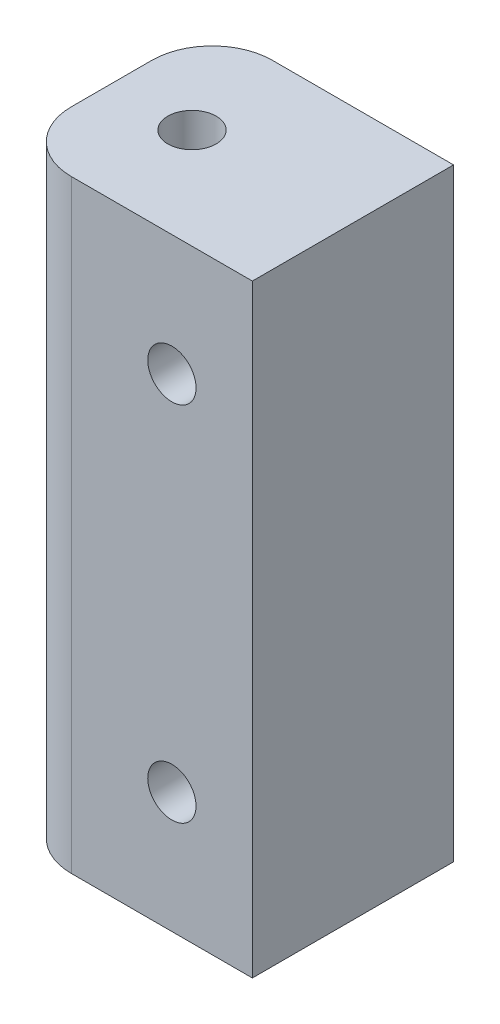
ISO-10303-21;
HEADER;
FILE_DESCRIPTION(('STEP AP214'),'2;1');
FILE_NAME('part.step','',(''),(''),'','','');
FILE_SCHEMA(('AUTOMOTIVE_DESIGN { 1 0 10303 214 1 1 1 1 }'));
ENDSEC;
DATA;
#1=APPLICATION_CONTEXT('core data for automotive mechanical design processes');
#2=APPLICATION_PROTOCOL_DEFINITION('international standard','automotive_design',2000,#1);
#3=PRODUCT_CONTEXT('',#1,'mechanical');
#4=PRODUCT('Part','Part','',(#3));
#5=PRODUCT_RELATED_PRODUCT_CATEGORY('part','',(#4));
#6=PRODUCT_DEFINITION_FORMATION('','',#4);
#7=PRODUCT_DEFINITION_CONTEXT('part definition',#1,'design');
#8=PRODUCT_DEFINITION('design','',#6,#7);
#9=PRODUCT_DEFINITION_SHAPE('','',#8);
#10=(LENGTH_UNIT() NAMED_UNIT(*) SI_UNIT(.MILLI.,.METRE.));
#11=(NAMED_UNIT(*) PLANE_ANGLE_UNIT() SI_UNIT($,.RADIAN.));
#12=(NAMED_UNIT(*) SI_UNIT($,.STERADIAN.) SOLID_ANGLE_UNIT());
#13=UNCERTAINTY_MEASURE_WITH_UNIT(LENGTH_MEASURE(1.E-05),#10,'distance_accuracy_value','');
#14=(GEOMETRIC_REPRESENTATION_CONTEXT(3) GLOBAL_UNCERTAINTY_ASSIGNED_CONTEXT((#13)) GLOBAL_UNIT_ASSIGNED_CONTEXT((#10,
#11,#12)) REPRESENTATION_CONTEXT('',''));
#15=CARTESIAN_POINT('',(0.,0.,0.));
#16=DIRECTION('',(0.,0.,1.));
#17=DIRECTION('',(1.,0.,0.));
#18=AXIS2_PLACEMENT_3D('',#15,#16,#17);
#19=CARTESIAN_POINT('',(0.,15.,0.));
#20=DIRECTION('',(0.,1.,0.));
#21=DIRECTION('',(0.,0.,1.));
#22=AXIS2_PLACEMENT_3D('',#19,#20,#21);
#23=PLANE('',#22);
#24=DIRECTION('',(-1.,0.,0.));
#25=VECTOR('',#24,1.);
#26=CARTESIAN_POINT('',(-6.,15.,-10.));
#27=LINE('',#26,#25);
#28=CARTESIAN_POINT('',(6.,15.,-10.));
#29=VERTEX_POINT('',#28);
#30=CARTESIAN_POINT('',(-3.,15.,-10.));
#31=VERTEX_POINT('',#30);
#32=EDGE_CURVE('E108',#29,#31,#27,.T.);
#33=ORIENTED_EDGE('',*,*,#32,.T.);
#34=CARTESIAN_POINT('',(-3.,15.,-7.));
#35=DIRECTION('',(0.,1.,0.));
#36=DIRECTION('',(0.,0.,1.));
#37=AXIS2_PLACEMENT_3D('',#34,#35,#36);
#38=CIRCLE('',#37,3.);
#39=CARTESIAN_POINT('',(-6.,15.,-7.));
#40=VERTEX_POINT('',#39);
#41=EDGE_CURVE('E41',#31,#40,#38,.T.);
#42=ORIENTED_EDGE('',*,*,#41,.T.);
#43=DIRECTION('',(0.,0.,1.));
#44=VECTOR('',#43,1.);
#45=CARTESIAN_POINT('',(-6.,15.,-10.));
#46=LINE('',#45,#44);
#47=CARTESIAN_POINT('',(-6.,15.,-3.));
#48=VERTEX_POINT('',#47);
#49=EDGE_CURVE('E94',#40,#48,#46,.T.);
#50=ORIENTED_EDGE('',*,*,#49,.T.);
#51=CARTESIAN_POINT('',(-3.,15.,-3.));
#52=DIRECTION('',(0.,1.,0.));
#53=DIRECTION('',(0.,0.,1.));
#54=AXIS2_PLACEMENT_3D('',#51,#52,#53);
#55=CIRCLE('',#54,3.);
#56=CARTESIAN_POINT('',(-3.,15.,0.));
#57=VERTEX_POINT('',#56);
#58=EDGE_CURVE('E48',#48,#57,#55,.T.);
#59=ORIENTED_EDGE('',*,*,#58,.T.);
#60=DIRECTION('',(1.,0.,0.));
#61=VECTOR('',#60,1.);
#62=CARTESIAN_POINT('',(-6.,15.,0.));
#63=LINE('',#62,#61);
#64=CARTESIAN_POINT('',(6.,15.,0.));
#65=VERTEX_POINT('',#64);
#66=EDGE_CURVE('E86',#57,#65,#63,.T.);
#67=ORIENTED_EDGE('',*,*,#66,.T.);
#68=DIRECTION('',(0.,0.,-1.));
#69=VECTOR('',#68,1.);
#70=CARTESIAN_POINT('',(6.,15.,-10.));
#71=LINE('',#70,#69);
#72=EDGE_CURVE('E90',#65,#29,#71,.T.);
#73=ORIENTED_EDGE('',*,*,#72,.T.);
#74=EDGE_LOOP('',(#33,#42,#50,#59,#67,#73));
#75=FACE_BOUND('',#74,.T.);
#76=CARTESIAN_POINT('',(-2.,15.,-5.));
#77=DIRECTION('',(0.,1.,0.));
#78=DIRECTION('',(0.,0.,1.));
#79=AXIS2_PLACEMENT_3D('',#76,#77,#78);
#80=CIRCLE('',#79,1.2);
#81=CARTESIAN_POINT('',(-2.,15.,-3.8));
#82=VERTEX_POINT('',#81);
#83=EDGE_CURVE('E116',#82,#82,#80,.T.);
#84=ORIENTED_EDGE('',*,*,#83,.F.);
#85=EDGE_LOOP('',(#84));
#86=FACE_BOUND('',#85,.T.);
#87=ADVANCED_FACE('F33',(#75,#86),#23,.T.);
#88=CARTESIAN_POINT('',(0.,-15.,0.));
#89=DIRECTION('',(0.,1.,0.));
#90=DIRECTION('',(0.,0.,1.));
#91=AXIS2_PLACEMENT_3D('',#88,#89,#90);
#92=PLANE('',#91);
#93=DIRECTION('',(0.,0.,1.));
#94=VECTOR('',#93,1.);
#95=CARTESIAN_POINT('',(-6.,-15.,-10.));
#96=LINE('',#95,#94);
#97=CARTESIAN_POINT('',(-6.,-15.,-7.));
#98=VERTEX_POINT('',#97);
#99=CARTESIAN_POINT('',(-6.,-15.,-3.));
#100=VERTEX_POINT('',#99);
#101=EDGE_CURVE('E113',#98,#100,#96,.T.);
#102=ORIENTED_EDGE('',*,*,#101,.F.);
#103=CARTESIAN_POINT('',(-3.,-15.,-7.));
#104=DIRECTION('',(0.,1.,0.));
#105=DIRECTION('',(0.,0.,1.));
#106=AXIS2_PLACEMENT_3D('',#103,#104,#105);
#107=CIRCLE('',#106,3.);
#108=CARTESIAN_POINT('',(-3.,-15.,-10.));
#109=VERTEX_POINT('',#108);
#110=EDGE_CURVE('E129',#98,#109,#107,.F.);
#111=ORIENTED_EDGE('',*,*,#110,.T.);
#112=DIRECTION('',(-1.,0.,0.));
#113=VECTOR('',#112,1.);
#114=CARTESIAN_POINT('',(-6.,-15.,-10.));
#115=LINE('',#114,#113);
#116=CARTESIAN_POINT('',(6.,-15.,-10.));
#117=VERTEX_POINT('',#116);
#118=EDGE_CURVE('E120',#117,#109,#115,.T.);
#119=ORIENTED_EDGE('',*,*,#118,.F.);
#120=DIRECTION('',(0.,0.,-1.));
#121=VECTOR('',#120,1.);
#122=CARTESIAN_POINT('',(6.,-15.,-10.));
#123=LINE('',#122,#121);
#124=CARTESIAN_POINT('',(6.,-15.,0.));
#125=VERTEX_POINT('',#124);
#126=EDGE_CURVE('E118',#125,#117,#123,.T.);
#127=ORIENTED_EDGE('',*,*,#126,.F.);
#128=DIRECTION('',(1.,0.,0.));
#129=VECTOR('',#128,1.);
#130=CARTESIAN_POINT('',(-6.,-15.,0.));
#131=LINE('',#130,#129);
#132=CARTESIAN_POINT('',(-3.,-15.,0.));
#133=VERTEX_POINT('',#132);
#134=EDGE_CURVE('E100',#133,#125,#131,.T.);
#135=ORIENTED_EDGE('',*,*,#134,.F.);
#136=CARTESIAN_POINT('',(-3.,-15.,-3.));
#137=DIRECTION('',(0.,1.,0.));
#138=DIRECTION('',(0.,0.,1.));
#139=AXIS2_PLACEMENT_3D('',#136,#137,#138);
#140=CIRCLE('',#139,3.);
#141=EDGE_CURVE('E127',#133,#100,#140,.F.);
#142=ORIENTED_EDGE('',*,*,#141,.T.);
#143=EDGE_LOOP('',(#102,#111,#119,#127,#135,#142));
#144=FACE_BOUND('',#143,.T.);
#145=CARTESIAN_POINT('',(-2.,-15.,-5.));
#146=DIRECTION('',(0.,1.,0.));
#147=DIRECTION('',(0.,0.,1.));
#148=AXIS2_PLACEMENT_3D('',#145,#146,#147);
#149=CIRCLE('',#148,1.2);
#150=CARTESIAN_POINT('',(-2.,-15.,-3.8));
#151=VERTEX_POINT('',#150);
#152=EDGE_CURVE('E190',#151,#151,#149,.T.);
#153=ORIENTED_EDGE('',*,*,#152,.T.);
#154=EDGE_LOOP('',(#153));
#155=FACE_BOUND('',#154,.T.);
#156=ADVANCED_FACE('F143',(#144,#155),#92,.F.);
#157=CARTESIAN_POINT('',(-6.,15.,-10.));
#158=DIRECTION('',(1.,0.,0.));
#159=DIRECTION('',(0.,0.,-1.));
#160=AXIS2_PLACEMENT_3D('',#157,#158,#159);
#161=PLANE('',#160);
#162=ORIENTED_EDGE('',*,*,#49,.F.);
#163=DIRECTION('',(0.,-1.,0.));
#164=VECTOR('',#163,1.);
#165=CARTESIAN_POINT('',(-6.,15.,-7.));
#166=LINE('',#165,#164);
#167=EDGE_CURVE('E124',#40,#98,#166,.T.);
#168=ORIENTED_EDGE('',*,*,#167,.T.);
#169=ORIENTED_EDGE('',*,*,#101,.T.);
#170=DIRECTION('',(0.,-1.,0.));
#171=VECTOR('',#170,1.);
#172=CARTESIAN_POINT('',(-6.,15.,-3.));
#173=LINE('',#172,#171);
#174=EDGE_CURVE('E103',#100,#48,#173,.F.);
#175=ORIENTED_EDGE('',*,*,#174,.T.);
#176=EDGE_LOOP('',(#162,#168,#169,#175));
#177=FACE_BOUND('',#176,.T.);
#178=ADVANCED_FACE('F137',(#177),#161,.F.);
#179=CARTESIAN_POINT('',(-6.,15.,0.));
#180=DIRECTION('',(0.,0.,-1.));
#181=DIRECTION('',(-1.,0.,0.));
#182=AXIS2_PLACEMENT_3D('',#179,#180,#181);
#183=PLANE('',#182);
#184=CARTESIAN_POINT('',(2.,-9.,0.));
#185=DIRECTION('',(0.,0.,1.));
#186=DIRECTION('',(-1.,0.,0.));
#187=AXIS2_PLACEMENT_3D('',#184,#185,#186);
#188=CIRCLE('',#187,1.2);
#189=CARTESIAN_POINT('',(0.799999999999998,-9.,0.));
#190=VERTEX_POINT('',#189);
#191=EDGE_CURVE('E181',#190,#190,#188,.T.);
#192=ORIENTED_EDGE('',*,*,#191,.F.);
#193=EDGE_LOOP('',(#192));
#194=FACE_BOUND('',#193,.T.);
#195=CARTESIAN_POINT('',(2.,9.,0.));
#196=DIRECTION('',(0.,0.,1.));
#197=DIRECTION('',(1.,0.,0.));
#198=AXIS2_PLACEMENT_3D('',#195,#196,#197);
#199=CIRCLE('',#198,1.2);
#200=CARTESIAN_POINT('',(3.2,9.,0.));
#201=VERTEX_POINT('',#200);
#202=EDGE_CURVE('E184',#201,#201,#199,.T.);
#203=ORIENTED_EDGE('',*,*,#202,.F.);
#204=EDGE_LOOP('',(#203));
#205=FACE_BOUND('',#204,.T.);
#206=ORIENTED_EDGE('',*,*,#66,.F.);
#207=DIRECTION('',(0.,-1.,0.));
#208=VECTOR('',#207,1.);
#209=CARTESIAN_POINT('',(-3.,15.,0.));
#210=LINE('',#209,#208);
#211=EDGE_CURVE('E11',#57,#133,#210,.T.);
#212=ORIENTED_EDGE('',*,*,#211,.T.);
#213=ORIENTED_EDGE('',*,*,#134,.T.);
#214=DIRECTION('',(0.,-1.,0.));
#215=VECTOR('',#214,1.);
#216=CARTESIAN_POINT('',(6.,15.,0.));
#217=LINE('',#216,#215);
#218=EDGE_CURVE('E97',#65,#125,#217,.T.);
#219=ORIENTED_EDGE('',*,*,#218,.F.);
#220=EDGE_LOOP('',(#206,#212,#213,#219));
#221=FACE_BOUND('',#220,.T.);
#222=ADVANCED_FACE('F98',(#194,#205,#221),#183,.F.);
#223=CARTESIAN_POINT('',(6.,15.,-10.));
#224=DIRECTION('',(-1.,0.,0.));
#225=DIRECTION('',(0.,0.,1.));
#226=AXIS2_PLACEMENT_3D('',#223,#224,#225);
#227=PLANE('',#226);
#228=ORIENTED_EDGE('',*,*,#126,.T.);
#229=DIRECTION('',(0.,-1.,0.));
#230=VECTOR('',#229,1.);
#231=CARTESIAN_POINT('',(6.,15.,-10.));
#232=LINE('',#231,#230);
#233=EDGE_CURVE('E104',#29,#117,#232,.T.);
#234=ORIENTED_EDGE('',*,*,#233,.F.);
#235=ORIENTED_EDGE('',*,*,#72,.F.);
#236=ORIENTED_EDGE('',*,*,#218,.T.);
#237=EDGE_LOOP('',(#228,#234,#235,#236));
#238=FACE_BOUND('',#237,.T.);
#239=ADVANCED_FACE('F106',(#238),#227,.F.);
#240=CARTESIAN_POINT('',(-6.,15.,-10.));
#241=DIRECTION('',(0.,0.,1.));
#242=DIRECTION('',(1.,0.,0.));
#243=AXIS2_PLACEMENT_3D('',#240,#241,#242);
#244=PLANE('',#243);
#245=CARTESIAN_POINT('',(2.,-9.,-10.));
#246=DIRECTION('',(0.,0.,1.));
#247=DIRECTION('',(-1.,0.,0.));
#248=AXIS2_PLACEMENT_3D('',#245,#246,#247);
#249=CIRCLE('',#248,1.2);
#250=CARTESIAN_POINT('',(0.799999999999998,-9.,-10.));
#251=VERTEX_POINT('',#250);
#252=EDGE_CURVE('E178',#251,#251,#249,.T.);
#253=ORIENTED_EDGE('',*,*,#252,.T.);
#254=EDGE_LOOP('',(#253));
#255=FACE_BOUND('',#254,.T.);
#256=CARTESIAN_POINT('',(2.,9.,-10.));
#257=DIRECTION('',(0.,0.,1.));
#258=DIRECTION('',(1.,0.,0.));
#259=AXIS2_PLACEMENT_3D('',#256,#257,#258);
#260=CIRCLE('',#259,1.2);
#261=CARTESIAN_POINT('',(3.2,9.,-10.));
#262=VERTEX_POINT('',#261);
#263=EDGE_CURVE('E187',#262,#262,#260,.T.);
#264=ORIENTED_EDGE('',*,*,#263,.T.);
#265=EDGE_LOOP('',(#264));
#266=FACE_BOUND('',#265,.T.);
#267=ORIENTED_EDGE('',*,*,#118,.T.);
#268=DIRECTION('',(0.,-1.,0.));
#269=VECTOR('',#268,1.);
#270=CARTESIAN_POINT('',(-3.,15.,-10.));
#271=LINE('',#270,#269);
#272=EDGE_CURVE('E56',#109,#31,#271,.F.);
#273=ORIENTED_EDGE('',*,*,#272,.T.);
#274=ORIENTED_EDGE('',*,*,#32,.F.);
#275=ORIENTED_EDGE('',*,*,#233,.T.);
#276=EDGE_LOOP('',(#267,#273,#274,#275));
#277=FACE_BOUND('',#276,.T.);
#278=ADVANCED_FACE('F145',(#255,#266,#277),#244,.F.);
#279=CARTESIAN_POINT('',(-2.,15.,-5.));
#280=DIRECTION('',(0.,-1.,0.));
#281=DIRECTION('',(0.,0.,-1.));
#282=AXIS2_PLACEMENT_3D('',#279,#280,#281);
#283=CYLINDRICAL_SURFACE('',#282,1.2);
#284=ORIENTED_EDGE('',*,*,#83,.T.);
#285=EDGE_LOOP('',(#284));
#286=FACE_BOUND('',#285,.T.);
#287=ORIENTED_EDGE('',*,*,#152,.F.);
#288=EDGE_LOOP('',(#287));
#289=FACE_BOUND('',#288,.T.);
#290=ADVANCED_FACE('F147',(#286,#289),#283,.F.);
#291=CARTESIAN_POINT('',(2.,9.,-10.));
#292=DIRECTION('',(0.,0.,1.));
#293=DIRECTION('',(1.,0.,0.));
#294=AXIS2_PLACEMENT_3D('',#291,#292,#293);
#295=CYLINDRICAL_SURFACE('',#294,1.2);
#296=ORIENTED_EDGE('',*,*,#263,.F.);
#297=EDGE_LOOP('',(#296));
#298=FACE_BOUND('',#297,.T.);
#299=ORIENTED_EDGE('',*,*,#202,.T.);
#300=EDGE_LOOP('',(#299));
#301=FACE_BOUND('',#300,.T.);
#302=ADVANCED_FACE('F154',(#298,#301),#295,.F.);
#303=CARTESIAN_POINT('',(2.,-9.,-10.));
#304=DIRECTION('',(0.,0.,1.));
#305=DIRECTION('',(1.,0.,0.));
#306=AXIS2_PLACEMENT_3D('',#303,#304,#305);
#307=CYLINDRICAL_SURFACE('',#306,1.2);
#308=ORIENTED_EDGE('',*,*,#252,.F.);
#309=EDGE_LOOP('',(#308));
#310=FACE_BOUND('',#309,.T.);
#311=ORIENTED_EDGE('',*,*,#191,.T.);
#312=EDGE_LOOP('',(#311));
#313=FACE_BOUND('',#312,.T.);
#314=ADVANCED_FACE('F169',(#310,#313),#307,.F.);
#315=CARTESIAN_POINT('',(-3.,15.,-7.));
#316=DIRECTION('',(0.,-1.,0.));
#317=DIRECTION('',(0.,0.,-1.));
#318=AXIS2_PLACEMENT_3D('',#315,#316,#317);
#319=CYLINDRICAL_SURFACE('',#318,3.);
#320=ORIENTED_EDGE('',*,*,#41,.F.);
#321=ORIENTED_EDGE('',*,*,#272,.F.);
#322=ORIENTED_EDGE('',*,*,#110,.F.);
#323=ORIENTED_EDGE('',*,*,#167,.F.);
#324=EDGE_LOOP('',(#320,#321,#322,#323));
#325=FACE_BOUND('',#324,.T.);
#326=ADVANCED_FACE('F140',(#325),#319,.T.);
#327=CARTESIAN_POINT('',(-3.,15.,-3.));
#328=DIRECTION('',(0.,-1.,0.));
#329=DIRECTION('',(0.,0.,-1.));
#330=AXIS2_PLACEMENT_3D('',#327,#328,#329);
#331=CYLINDRICAL_SURFACE('',#330,3.);
#332=ORIENTED_EDGE('',*,*,#58,.F.);
#333=ORIENTED_EDGE('',*,*,#174,.F.);
#334=ORIENTED_EDGE('',*,*,#141,.F.);
#335=ORIENTED_EDGE('',*,*,#211,.F.);
#336=EDGE_LOOP('',(#332,#333,#334,#335));
#337=FACE_BOUND('',#336,.T.);
#338=ADVANCED_FACE('F35',(#337),#331,.T.);
#339=CLOSED_SHELL('',(#87,#156,#178,#222,#239,#278,#290,#302,#314,#326,#338));
#340=MANIFOLD_SOLID_BREP('B2',#339);
#341=ADVANCED_BREP_SHAPE_REPRESENTATION('',(#18,#340),#14);
#342=SHAPE_DEFINITION_REPRESENTATION(#9,#341);
ENDSEC;
END-ISO-10303-21;
